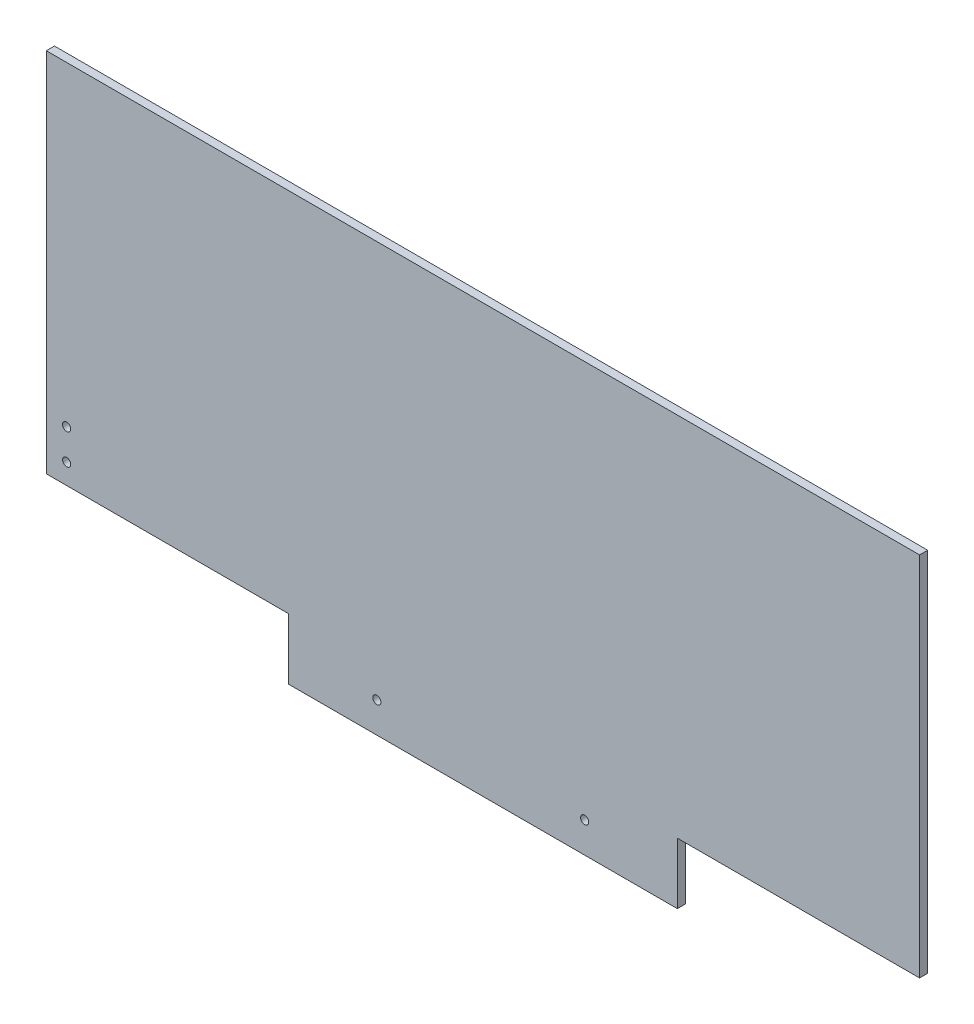
ISO-10303-21;
HEADER;
FILE_DESCRIPTION(('STEP AP214'),'2;1');
FILE_NAME('part.step','',(''),(''),'','','');
FILE_SCHEMA(('AUTOMOTIVE_DESIGN { 1 0 10303 214 1 1 1 1 }'));
ENDSEC;
DATA;
#1=APPLICATION_CONTEXT('core data for automotive mechanical design processes');
#2=APPLICATION_PROTOCOL_DEFINITION('international standard','automotive_design',2000,#1);
#3=PRODUCT_CONTEXT('',#1,'mechanical');
#4=PRODUCT('Part','Part','',(#3));
#5=PRODUCT_RELATED_PRODUCT_CATEGORY('part','',(#4));
#6=PRODUCT_DEFINITION_FORMATION('','',#4);
#7=PRODUCT_DEFINITION_CONTEXT('part definition',#1,'design');
#8=PRODUCT_DEFINITION('design','',#6,#7);
#9=PRODUCT_DEFINITION_SHAPE('','',#8);
#10=(LENGTH_UNIT() NAMED_UNIT(*) SI_UNIT(.MILLI.,.METRE.));
#11=(NAMED_UNIT(*) PLANE_ANGLE_UNIT() SI_UNIT($,.RADIAN.));
#12=(NAMED_UNIT(*) SI_UNIT($,.STERADIAN.) SOLID_ANGLE_UNIT());
#13=UNCERTAINTY_MEASURE_WITH_UNIT(LENGTH_MEASURE(1.E-05),#10,'distance_accuracy_value','');
#14=(GEOMETRIC_REPRESENTATION_CONTEXT(3) GLOBAL_UNCERTAINTY_ASSIGNED_CONTEXT((#13)) GLOBAL_UNIT_ASSIGNED_CONTEXT((#10,
#11,#12)) REPRESENTATION_CONTEXT('',''));
#15=CARTESIAN_POINT('',(0.,0.,0.));
#16=DIRECTION('',(0.,0.,1.));
#17=DIRECTION('',(1.,0.,0.));
#18=AXIS2_PLACEMENT_3D('',#15,#16,#17);
#19=CARTESIAN_POINT('',(214.5,105.,4.));
#20=DIRECTION('',(-1.,0.,0.));
#21=DIRECTION('',(0.,0.,1.));
#22=AXIS2_PLACEMENT_3D('',#19,#20,#21);
#23=PLANE('',#22);
#24=DIRECTION('',(0.,1.,0.));
#25=VECTOR('',#24,1.);
#26=CARTESIAN_POINT('',(214.5,105.,4.));
#27=LINE('',#26,#25);
#28=CARTESIAN_POINT('',(214.5,-75.,4.));
#29=VERTEX_POINT('',#28);
#30=CARTESIAN_POINT('',(214.5,105.,4.));
#31=VERTEX_POINT('',#30);
#32=EDGE_CURVE('E141',#29,#31,#27,.T.);
#33=ORIENTED_EDGE('',*,*,#32,.F.);
#34=DIRECTION('',(0.,0.,-1.));
#35=VECTOR('',#34,1.);
#36=CARTESIAN_POINT('',(214.5,-75.,4.));
#37=LINE('',#36,#35);
#38=CARTESIAN_POINT('',(214.5,-75.,0.));
#39=VERTEX_POINT('',#38);
#40=EDGE_CURVE('E136',#29,#39,#37,.T.);
#41=ORIENTED_EDGE('',*,*,#40,.T.);
#42=DIRECTION('',(0.,1.,0.));
#43=VECTOR('',#42,1.);
#44=CARTESIAN_POINT('',(214.5,105.,0.));
#45=LINE('',#44,#43);
#46=CARTESIAN_POINT('',(214.5,105.,0.));
#47=VERTEX_POINT('',#46);
#48=EDGE_CURVE('E133',#39,#47,#45,.T.);
#49=ORIENTED_EDGE('',*,*,#48,.T.);
#50=DIRECTION('',(0.,0.,-1.));
#51=VECTOR('',#50,1.);
#52=CARTESIAN_POINT('',(214.5,105.,4.));
#53=LINE('',#52,#51);
#54=EDGE_CURVE('E11',#31,#47,#53,.T.);
#55=ORIENTED_EDGE('',*,*,#54,.F.);
#56=EDGE_LOOP('',(#33,#41,#49,#55));
#57=FACE_BOUND('',#56,.T.);
#58=ADVANCED_FACE('F37',(#57),#23,.F.);
#59=CARTESIAN_POINT('',(-214.5,105.,4.));
#60=DIRECTION('',(0.,-1.,0.));
#61=DIRECTION('',(0.,0.,-1.));
#62=AXIS2_PLACEMENT_3D('',#59,#60,#61);
#63=PLANE('',#62);
#64=DIRECTION('',(-1.,0.,0.));
#65=VECTOR('',#64,1.);
#66=CARTESIAN_POINT('',(-214.5,105.,0.));
#67=LINE('',#66,#65);
#68=CARTESIAN_POINT('',(-214.5,105.,0.));
#69=VERTEX_POINT('',#68);
#70=EDGE_CURVE('E135',#47,#69,#67,.T.);
#71=ORIENTED_EDGE('',*,*,#70,.T.);
#72=DIRECTION('',(0.,0.,-1.));
#73=VECTOR('',#72,1.);
#74=CARTESIAN_POINT('',(-214.5,105.,4.));
#75=LINE('',#74,#73);
#76=CARTESIAN_POINT('',(-214.5,105.,4.));
#77=VERTEX_POINT('',#76);
#78=EDGE_CURVE('E44',#77,#69,#75,.T.);
#79=ORIENTED_EDGE('',*,*,#78,.F.);
#80=DIRECTION('',(-1.,0.,0.));
#81=VECTOR('',#80,1.);
#82=CARTESIAN_POINT('',(-214.5,105.,4.));
#83=LINE('',#82,#81);
#84=EDGE_CURVE('E129',#31,#77,#83,.T.);
#85=ORIENTED_EDGE('',*,*,#84,.F.);
#86=ORIENTED_EDGE('',*,*,#54,.T.);
#87=EDGE_LOOP('',(#71,#79,#85,#86));
#88=FACE_BOUND('',#87,.T.);
#89=ADVANCED_FACE('F231',(#88),#63,.F.);
#90=CARTESIAN_POINT('',(-214.5,105.,4.));
#91=DIRECTION('',(1.,0.,0.));
#92=DIRECTION('',(0.,0.,-1.));
#93=AXIS2_PLACEMENT_3D('',#90,#91,#92);
#94=PLANE('',#93);
#95=DIRECTION('',(0.,-1.,0.));
#96=VECTOR('',#95,1.);
#97=CARTESIAN_POINT('',(-214.5,105.,0.));
#98=LINE('',#97,#96);
#99=CARTESIAN_POINT('',(-214.5,-75.,0.));
#100=VERTEX_POINT('',#99);
#101=EDGE_CURVE('E138',#69,#100,#98,.T.);
#102=ORIENTED_EDGE('',*,*,#101,.T.);
#103=DIRECTION('',(0.,0.,-1.));
#104=VECTOR('',#103,1.);
#105=CARTESIAN_POINT('',(-214.5,-75.,4.));
#106=LINE('',#105,#104);
#107=CARTESIAN_POINT('',(-214.5,-75.,4.));
#108=VERTEX_POINT('',#107);
#109=EDGE_CURVE('E51',#108,#100,#106,.T.);
#110=ORIENTED_EDGE('',*,*,#109,.F.);
#111=DIRECTION('',(0.,-1.,0.));
#112=VECTOR('',#111,1.);
#113=CARTESIAN_POINT('',(-214.5,105.,4.));
#114=LINE('',#113,#112);
#115=EDGE_CURVE('E125',#77,#108,#114,.T.);
#116=ORIENTED_EDGE('',*,*,#115,.F.);
#117=ORIENTED_EDGE('',*,*,#78,.T.);
#118=EDGE_LOOP('',(#102,#110,#116,#117));
#119=FACE_BOUND('',#118,.T.);
#120=ADVANCED_FACE('F235',(#119),#94,.F.);
#121=CARTESIAN_POINT('',(-214.5,-105.,4.));
#122=DIRECTION('',(0.,1.,0.));
#123=DIRECTION('',(0.,0.,1.));
#124=AXIS2_PLACEMENT_3D('',#121,#122,#123);
#125=PLANE('',#124);
#126=DIRECTION('',(1.,0.,0.));
#127=VECTOR('',#126,1.);
#128=CARTESIAN_POINT('',(-214.5,-105.,0.));
#129=LINE('',#128,#127);
#130=CARTESIAN_POINT('',(-95.5,-105.,0.));
#131=VERTEX_POINT('',#130);
#132=CARTESIAN_POINT('',(95.5,-105.,0.));
#133=VERTEX_POINT('',#132);
#134=EDGE_CURVE('E118',#131,#133,#129,.T.);
#135=ORIENTED_EDGE('',*,*,#134,.T.);
#136=DIRECTION('',(0.,0.,-1.));
#137=VECTOR('',#136,1.);
#138=CARTESIAN_POINT('',(95.5,-105.,4.));
#139=LINE('',#138,#137);
#140=CARTESIAN_POINT('',(95.5,-105.,4.));
#141=VERTEX_POINT('',#140);
#142=EDGE_CURVE('E59',#141,#133,#139,.T.);
#143=ORIENTED_EDGE('',*,*,#142,.F.);
#144=DIRECTION('',(1.,0.,0.));
#145=VECTOR('',#144,1.);
#146=CARTESIAN_POINT('',(-214.5,-105.,4.));
#147=LINE('',#146,#145);
#148=CARTESIAN_POINT('',(-95.5,-105.,4.));
#149=VERTEX_POINT('',#148);
#150=EDGE_CURVE('E116',#149,#141,#147,.T.);
#151=ORIENTED_EDGE('',*,*,#150,.F.);
#152=DIRECTION('',(0.,0.,-1.));
#153=VECTOR('',#152,1.);
#154=CARTESIAN_POINT('',(-95.5,-105.,4.));
#155=LINE('',#154,#153);
#156=EDGE_CURVE('E149',#149,#131,#155,.T.);
#157=ORIENTED_EDGE('',*,*,#156,.T.);
#158=EDGE_LOOP('',(#135,#143,#151,#157));
#159=FACE_BOUND('',#158,.T.);
#160=ADVANCED_FACE('F114',(#159),#125,.F.);
#161=CARTESIAN_POINT('',(0.,0.,4.));
#162=DIRECTION('',(0.,0.,1.));
#163=DIRECTION('',(1.,0.,0.));
#164=AXIS2_PLACEMENT_3D('',#161,#162,#163);
#165=PLANE('',#164);
#166=CARTESIAN_POINT('',(-204.5,-65.,4.));
#167=DIRECTION('',(0.,0.,-1.));
#168=DIRECTION('',(-1.,0.,0.));
#169=AXIS2_PLACEMENT_3D('',#166,#167,#168);
#170=CIRCLE('',#169,2.);
#171=CARTESIAN_POINT('',(-206.5,-65.,4.));
#172=VERTEX_POINT('',#171);
#173=EDGE_CURVE('E170',#172,#172,#170,.T.);
#174=ORIENTED_EDGE('',*,*,#173,.T.);
#175=EDGE_LOOP('',(#174));
#176=FACE_BOUND('',#175,.T.);
#177=CARTESIAN_POINT('',(-204.5,-50.,4.));
#178=DIRECTION('',(0.,0.,-1.));
#179=DIRECTION('',(-1.,0.,0.));
#180=AXIS2_PLACEMENT_3D('',#177,#178,#179);
#181=CIRCLE('',#180,2.);
#182=CARTESIAN_POINT('',(-206.5,-50.,4.));
#183=VERTEX_POINT('',#182);
#184=EDGE_CURVE('E181',#183,#183,#181,.T.);
#185=ORIENTED_EDGE('',*,*,#184,.T.);
#186=EDGE_LOOP('',(#185));
#187=FACE_BOUND('',#186,.T.);
#188=CARTESIAN_POINT('',(49.9836025127862,-90.,4.));
#189=DIRECTION('',(0.,0.,-1.));
#190=DIRECTION('',(-1.,0.,0.));
#191=AXIS2_PLACEMENT_3D('',#188,#189,#190);
#192=CIRCLE('',#191,2.);
#193=CARTESIAN_POINT('',(47.9836025127862,-90.,4.));
#194=VERTEX_POINT('',#193);
#195=EDGE_CURVE('E157',#194,#194,#192,.T.);
#196=ORIENTED_EDGE('',*,*,#195,.T.);
#197=EDGE_LOOP('',(#196));
#198=FACE_BOUND('',#197,.T.);
#199=CARTESIAN_POINT('',(-52.1257569061911,-90.,4.));
#200=DIRECTION('',(0.,0.,-1.));
#201=DIRECTION('',(-1.,0.,0.));
#202=AXIS2_PLACEMENT_3D('',#199,#200,#201);
#203=CIRCLE('',#202,2.);
#204=CARTESIAN_POINT('',(-54.1257569061911,-90.,4.));
#205=VERTEX_POINT('',#204);
#206=EDGE_CURVE('E169',#205,#205,#203,.T.);
#207=ORIENTED_EDGE('',*,*,#206,.T.);
#208=EDGE_LOOP('',(#207));
#209=FACE_BOUND('',#208,.T.);
#210=DIRECTION('',(1.,0.,0.));
#211=VECTOR('',#210,1.);
#212=CARTESIAN_POINT('',(214.5,-75.,4.));
#213=LINE('',#212,#211);
#214=CARTESIAN_POINT('',(95.5,-75.,4.));
#215=VERTEX_POINT('',#214);
#216=EDGE_CURVE('E108',#215,#29,#213,.T.);
#217=ORIENTED_EDGE('',*,*,#216,.T.);
#218=ORIENTED_EDGE('',*,*,#32,.T.);
#219=ORIENTED_EDGE('',*,*,#84,.T.);
#220=ORIENTED_EDGE('',*,*,#115,.T.);
#221=DIRECTION('',(1.,0.,0.));
#222=VECTOR('',#221,1.);
#223=CARTESIAN_POINT('',(-214.5,-75.,4.));
#224=LINE('',#223,#222);
#225=CARTESIAN_POINT('',(-95.5,-75.0000000000001,4.));
#226=VERTEX_POINT('',#225);
#227=EDGE_CURVE('E154',#108,#226,#224,.T.);
#228=ORIENTED_EDGE('',*,*,#227,.T.);
#229=DIRECTION('',(0.,-1.,0.));
#230=VECTOR('',#229,1.);
#231=CARTESIAN_POINT('',(-95.5,-75.0000000000001,4.));
#232=LINE('',#231,#230);
#233=EDGE_CURVE('E124',#226,#149,#232,.T.);
#234=ORIENTED_EDGE('',*,*,#233,.T.);
#235=ORIENTED_EDGE('',*,*,#150,.T.);
#236=DIRECTION('',(0.,1.,0.));
#237=VECTOR('',#236,1.);
#238=CARTESIAN_POINT('',(95.5,-75.,4.));
#239=LINE('',#238,#237);
#240=EDGE_CURVE('E101',#141,#215,#239,.T.);
#241=ORIENTED_EDGE('',*,*,#240,.T.);
#242=EDGE_LOOP('',(#217,#218,#219,#220,#228,#234,#235,#241));
#243=FACE_BOUND('',#242,.T.);
#244=ADVANCED_FACE('F121',(#176,#187,#198,#209,#243),#165,.T.);
#245=CARTESIAN_POINT('',(0.,0.,0.));
#246=DIRECTION('',(0.,0.,1.));
#247=DIRECTION('',(1.,0.,0.));
#248=AXIS2_PLACEMENT_3D('',#245,#246,#247);
#249=PLANE('',#248);
#250=CARTESIAN_POINT('',(-204.5,-65.,0.));
#251=DIRECTION('',(0.,0.,-1.));
#252=DIRECTION('',(-1.,0.,0.));
#253=AXIS2_PLACEMENT_3D('',#250,#251,#252);
#254=CIRCLE('',#253,2.);
#255=CARTESIAN_POINT('',(-206.5,-65.,0.));
#256=VERTEX_POINT('',#255);
#257=EDGE_CURVE('E184',#256,#256,#254,.T.);
#258=ORIENTED_EDGE('',*,*,#257,.F.);
#259=EDGE_LOOP('',(#258));
#260=FACE_BOUND('',#259,.T.);
#261=CARTESIAN_POINT('',(-204.5,-50.,0.));
#262=DIRECTION('',(0.,0.,-1.));
#263=DIRECTION('',(-1.,0.,0.));
#264=AXIS2_PLACEMENT_3D('',#261,#262,#263);
#265=CIRCLE('',#264,2.);
#266=CARTESIAN_POINT('',(-206.5,-50.,0.));
#267=VERTEX_POINT('',#266);
#268=EDGE_CURVE('E178',#267,#267,#265,.T.);
#269=ORIENTED_EDGE('',*,*,#268,.F.);
#270=EDGE_LOOP('',(#269));
#271=FACE_BOUND('',#270,.T.);
#272=CARTESIAN_POINT('',(49.9836025127862,-90.,0.));
#273=DIRECTION('',(0.,0.,-1.));
#274=DIRECTION('',(-1.,0.,0.));
#275=AXIS2_PLACEMENT_3D('',#272,#273,#274);
#276=CIRCLE('',#275,2.);
#277=CARTESIAN_POINT('',(47.9836025127862,-90.,0.));
#278=VERTEX_POINT('',#277);
#279=EDGE_CURVE('E173',#278,#278,#276,.T.);
#280=ORIENTED_EDGE('',*,*,#279,.F.);
#281=EDGE_LOOP('',(#280));
#282=FACE_BOUND('',#281,.T.);
#283=CARTESIAN_POINT('',(-52.1257569061911,-90.,0.));
#284=DIRECTION('',(0.,0.,-1.));
#285=DIRECTION('',(-1.,0.,0.));
#286=AXIS2_PLACEMENT_3D('',#283,#284,#285);
#287=CIRCLE('',#286,2.);
#288=CARTESIAN_POINT('',(-54.1257569061911,-90.,0.));
#289=VERTEX_POINT('',#288);
#290=EDGE_CURVE('E166',#289,#289,#287,.T.);
#291=ORIENTED_EDGE('',*,*,#290,.F.);
#292=EDGE_LOOP('',(#291));
#293=FACE_BOUND('',#292,.T.);
#294=ORIENTED_EDGE('',*,*,#48,.F.);
#295=DIRECTION('',(1.,0.,0.));
#296=VECTOR('',#295,1.);
#297=CARTESIAN_POINT('',(214.5,-75.,0.));
#298=LINE('',#297,#296);
#299=CARTESIAN_POINT('',(95.5,-75.,0.));
#300=VERTEX_POINT('',#299);
#301=EDGE_CURVE('E109',#300,#39,#298,.T.);
#302=ORIENTED_EDGE('',*,*,#301,.F.);
#303=DIRECTION('',(0.,1.,0.));
#304=VECTOR('',#303,1.);
#305=CARTESIAN_POINT('',(95.5,-75.,0.));
#306=LINE('',#305,#304);
#307=EDGE_CURVE('E151',#133,#300,#306,.T.);
#308=ORIENTED_EDGE('',*,*,#307,.F.);
#309=ORIENTED_EDGE('',*,*,#134,.F.);
#310=DIRECTION('',(0.,-1.,0.));
#311=VECTOR('',#310,1.);
#312=CARTESIAN_POINT('',(-95.5,-75.0000000000001,0.));
#313=LINE('',#312,#311);
#314=CARTESIAN_POINT('',(-95.5,-75.0000000000001,0.));
#315=VERTEX_POINT('',#314);
#316=EDGE_CURVE('E152',#315,#131,#313,.T.);
#317=ORIENTED_EDGE('',*,*,#316,.F.);
#318=DIRECTION('',(1.,0.,0.));
#319=VECTOR('',#318,1.);
#320=CARTESIAN_POINT('',(-214.5,-75.,0.));
#321=LINE('',#320,#319);
#322=EDGE_CURVE('E155',#100,#315,#321,.T.);
#323=ORIENTED_EDGE('',*,*,#322,.F.);
#324=ORIENTED_EDGE('',*,*,#101,.F.);
#325=ORIENTED_EDGE('',*,*,#70,.F.);
#326=EDGE_LOOP('',(#294,#302,#308,#309,#317,#323,#324,#325));
#327=FACE_BOUND('',#326,.T.);
#328=ADVANCED_FACE('F199',(#260,#271,#282,#293,#327),#249,.F.);
#329=CARTESIAN_POINT('',(-95.5,-75.0000000000001,4.));
#330=DIRECTION('',(1.,0.,0.));
#331=DIRECTION('',(0.,0.,-1.));
#332=AXIS2_PLACEMENT_3D('',#329,#330,#331);
#333=PLANE('',#332);
#334=ORIENTED_EDGE('',*,*,#316,.T.);
#335=ORIENTED_EDGE('',*,*,#156,.F.);
#336=ORIENTED_EDGE('',*,*,#233,.F.);
#337=DIRECTION('',(0.,0.,-1.));
#338=VECTOR('',#337,1.);
#339=CARTESIAN_POINT('',(-95.5,-75.0000000000001,4.));
#340=LINE('',#339,#338);
#341=EDGE_CURVE('E147',#226,#315,#340,.T.);
#342=ORIENTED_EDGE('',*,*,#341,.T.);
#343=EDGE_LOOP('',(#334,#335,#336,#342));
#344=FACE_BOUND('',#343,.T.);
#345=ADVANCED_FACE('F202',(#344),#333,.F.);
#346=CARTESIAN_POINT('',(-214.5,-75.,4.));
#347=DIRECTION('',(0.,1.,0.));
#348=DIRECTION('',(-1.,0.,0.));
#349=AXIS2_PLACEMENT_3D('',#346,#347,#348);
#350=PLANE('',#349);
#351=ORIENTED_EDGE('',*,*,#322,.T.);
#352=ORIENTED_EDGE('',*,*,#341,.F.);
#353=ORIENTED_EDGE('',*,*,#227,.F.);
#354=ORIENTED_EDGE('',*,*,#109,.T.);
#355=EDGE_LOOP('',(#351,#352,#353,#354));
#356=FACE_BOUND('',#355,.T.);
#357=ADVANCED_FACE('F220',(#356),#350,.F.);
#358=CARTESIAN_POINT('',(214.5,-75.,4.));
#359=DIRECTION('',(0.,1.,0.));
#360=DIRECTION('',(0.,0.,1.));
#361=AXIS2_PLACEMENT_3D('',#358,#359,#360);
#362=PLANE('',#361);
#363=ORIENTED_EDGE('',*,*,#301,.T.);
#364=ORIENTED_EDGE('',*,*,#40,.F.);
#365=ORIENTED_EDGE('',*,*,#216,.F.);
#366=DIRECTION('',(0.,0.,-1.));
#367=VECTOR('',#366,1.);
#368=CARTESIAN_POINT('',(95.5,-75.,4.));
#369=LINE('',#368,#367);
#370=EDGE_CURVE('E103',#215,#300,#369,.T.);
#371=ORIENTED_EDGE('',*,*,#370,.T.);
#372=EDGE_LOOP('',(#363,#364,#365,#371));
#373=FACE_BOUND('',#372,.T.);
#374=ADVANCED_FACE('F217',(#373),#362,.F.);
#375=CARTESIAN_POINT('',(95.5,-75.,4.));
#376=DIRECTION('',(-1.,0.,0.));
#377=DIRECTION('',(0.,-1.,0.));
#378=AXIS2_PLACEMENT_3D('',#375,#376,#377);
#379=PLANE('',#378);
#380=ORIENTED_EDGE('',*,*,#307,.T.);
#381=ORIENTED_EDGE('',*,*,#370,.F.);
#382=ORIENTED_EDGE('',*,*,#240,.F.);
#383=ORIENTED_EDGE('',*,*,#142,.T.);
#384=EDGE_LOOP('',(#380,#381,#382,#383));
#385=FACE_BOUND('',#384,.T.);
#386=ADVANCED_FACE('F102',(#385),#379,.F.);
#387=CARTESIAN_POINT('',(-52.1257569061911,-90.,4.));
#388=DIRECTION('',(0.,0.,-1.));
#389=DIRECTION('',(-1.,0.,0.));
#390=AXIS2_PLACEMENT_3D('',#387,#388,#389);
#391=CYLINDRICAL_SURFACE('',#390,2.);
#392=ORIENTED_EDGE('',*,*,#206,.F.);
#393=EDGE_LOOP('',(#392));
#394=FACE_BOUND('',#393,.T.);
#395=ORIENTED_EDGE('',*,*,#290,.T.);
#396=EDGE_LOOP('',(#395));
#397=FACE_BOUND('',#396,.T.);
#398=ADVANCED_FACE('F281',(#394,#397),#391,.F.);
#399=CARTESIAN_POINT('',(49.9836025127862,-90.,4.));
#400=DIRECTION('',(0.,0.,-1.));
#401=DIRECTION('',(-1.,0.,0.));
#402=AXIS2_PLACEMENT_3D('',#399,#400,#401);
#403=CYLINDRICAL_SURFACE('',#402,2.);
#404=ORIENTED_EDGE('',*,*,#195,.F.);
#405=EDGE_LOOP('',(#404));
#406=FACE_BOUND('',#405,.T.);
#407=ORIENTED_EDGE('',*,*,#279,.T.);
#408=EDGE_LOOP('',(#407));
#409=FACE_BOUND('',#408,.T.);
#410=ADVANCED_FACE('F289',(#406,#409),#403,.F.);
#411=CARTESIAN_POINT('',(-204.5,-50.,4.));
#412=DIRECTION('',(0.,0.,-1.));
#413=DIRECTION('',(-1.,0.,0.));
#414=AXIS2_PLACEMENT_3D('',#411,#412,#413);
#415=CYLINDRICAL_SURFACE('',#414,2.);
#416=ORIENTED_EDGE('',*,*,#184,.F.);
#417=EDGE_LOOP('',(#416));
#418=FACE_BOUND('',#417,.T.);
#419=ORIENTED_EDGE('',*,*,#268,.T.);
#420=EDGE_LOOP('',(#419));
#421=FACE_BOUND('',#420,.T.);
#422=ADVANCED_FACE('F195',(#418,#421),#415,.F.);
#423=CARTESIAN_POINT('',(-204.5,-65.,4.));
#424=DIRECTION('',(0.,0.,-1.));
#425=DIRECTION('',(-1.,0.,0.));
#426=AXIS2_PLACEMENT_3D('',#423,#424,#425);
#427=CYLINDRICAL_SURFACE('',#426,2.);
#428=ORIENTED_EDGE('',*,*,#173,.F.);
#429=EDGE_LOOP('',(#428));
#430=FACE_BOUND('',#429,.T.);
#431=ORIENTED_EDGE('',*,*,#257,.T.);
#432=EDGE_LOOP('',(#431));
#433=FACE_BOUND('',#432,.T.);
#434=ADVANCED_FACE('F192',(#430,#433),#427,.F.);
#435=CLOSED_SHELL('',(#58,#89,#120,#160,#244,#328,#345,#357,#374,#386,#398,#410,#422,#434));
#436=MANIFOLD_SOLID_BREP('B2',#435);
#437=ADVANCED_BREP_SHAPE_REPRESENTATION('',(#18,#436),#14);
#438=SHAPE_DEFINITION_REPRESENTATION(#9,#437);
ENDSEC;
END-ISO-10303-21;
